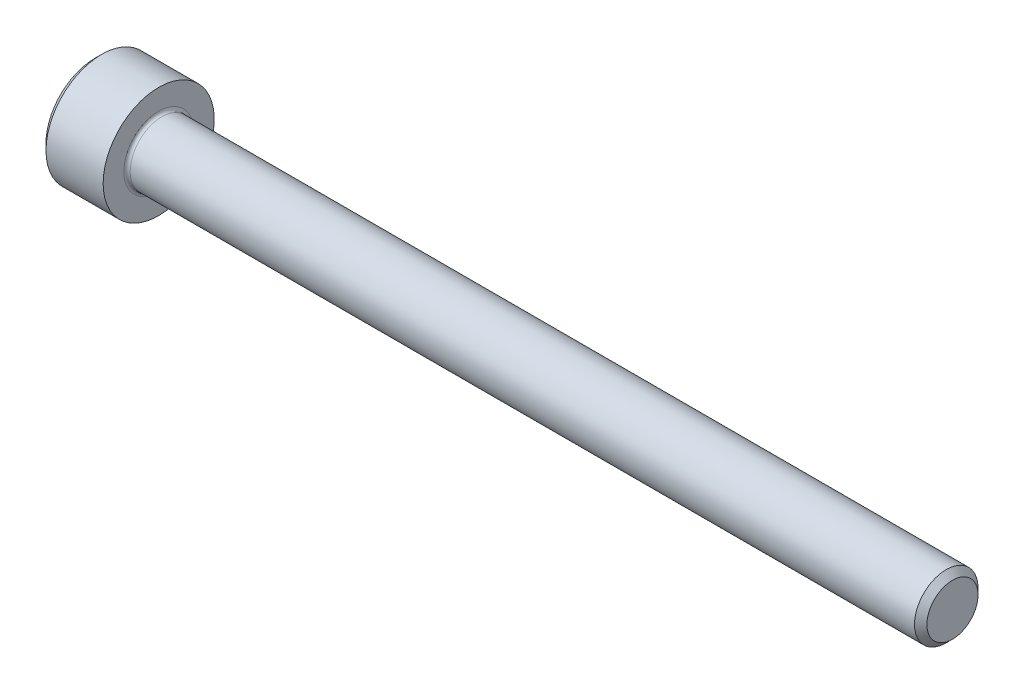
ISO-10303-21;
HEADER;
FILE_DESCRIPTION(('STEP AP214'),'2;1');
FILE_NAME('part.step','',(''),(''),'','','');
FILE_SCHEMA(('AUTOMOTIVE_DESIGN { 1 0 10303 214 1 1 1 1 }'));
ENDSEC;
DATA;
#1=APPLICATION_CONTEXT('core data for automotive mechanical design processes');
#2=APPLICATION_PROTOCOL_DEFINITION('international standard','automotive_design',2000,#1);
#3=PRODUCT_CONTEXT('',#1,'mechanical');
#4=PRODUCT('Part','Part','',(#3));
#5=PRODUCT_RELATED_PRODUCT_CATEGORY('part','',(#4));
#6=PRODUCT_DEFINITION_FORMATION('','',#4);
#7=PRODUCT_DEFINITION_CONTEXT('part definition',#1,'design');
#8=PRODUCT_DEFINITION('design','',#6,#7);
#9=PRODUCT_DEFINITION_SHAPE('','',#8);
#10=(LENGTH_UNIT() NAMED_UNIT(*) SI_UNIT(.MILLI.,.METRE.));
#11=(NAMED_UNIT(*) PLANE_ANGLE_UNIT() SI_UNIT($,.RADIAN.));
#12=(NAMED_UNIT(*) SI_UNIT($,.STERADIAN.) SOLID_ANGLE_UNIT());
#13=UNCERTAINTY_MEASURE_WITH_UNIT(LENGTH_MEASURE(1.E-05),#10,'distance_accuracy_value','');
#14=(GEOMETRIC_REPRESENTATION_CONTEXT(3) GLOBAL_UNCERTAINTY_ASSIGNED_CONTEXT((#13)) GLOBAL_UNIT_ASSIGNED_CONTEXT((#10,
#11,#12)) REPRESENTATION_CONTEXT('',''));
#15=CARTESIAN_POINT('',(0.,0.,0.));
#16=DIRECTION('',(0.,0.,1.));
#17=DIRECTION('',(1.,0.,0.));
#18=AXIS2_PLACEMENT_3D('',#15,#16,#17);
#19=CARTESIAN_POINT('',(2.00000000012324,0.,0.));
#20=DIRECTION('',(-1.,0.,0.));
#21=DIRECTION('',(0.,0.,1.));
#22=AXIS2_PLACEMENT_3D('',#19,#20,#21);
#23=CONICAL_SURFACE('',#22,1.53549999976121,1.04719755097356);
#24=CARTESIAN_POINT('',(2.88652133838241,0.,3.12638803734444E-10));
#25=VERTEX_POINT('',#24);
#26=VERTEX_LOOP('',#25);
#27=FACE_BOUND('',#26,.T.);
#28=CARTESIAN_POINT('',(1.99999999999196,0.,0.));
#29=DIRECTION('',(-1.,0.,0.));
#30=DIRECTION('',(0.,0.,1.));
#31=AXIS2_PLACEMENT_3D('',#28,#29,#30);
#32=CIRCLE('',#31,1.53549999998859);
#33=CARTESIAN_POINT('',(1.99999999999837,0.,1.53549999999715));
#34=VERTEX_POINT('',#33);
#35=CARTESIAN_POINT('',(1.99999999999598,-1.32978200750606,0.767749999997149));
#36=VERTEX_POINT('',#35);
#37=EDGE_CURVE('E95',#34,#36,#32,.F.);
#38=ORIENTED_EDGE('',*,*,#37,.F.);
#39=CARTESIAN_POINT('',(1.99999999999196,0.,0.));
#40=DIRECTION('',(-1.,0.,0.));
#41=DIRECTION('',(0.,0.,1.));
#42=AXIS2_PLACEMENT_3D('',#39,#40,#41);
#43=CIRCLE('',#42,1.53549999998859);
#44=CARTESIAN_POINT('',(1.99999999999598,1.32978200750606,0.767749999997146));
#45=VERTEX_POINT('',#44);
#46=EDGE_CURVE('E98',#34,#45,#43,.T.);
#47=ORIENTED_EDGE('',*,*,#46,.T.);
#48=CARTESIAN_POINT('',(1.99999999999196,0.,0.));
#49=DIRECTION('',(-1.,0.,0.));
#50=DIRECTION('',(0.,0.,1.));
#51=AXIS2_PLACEMENT_3D('',#48,#49,#50);
#52=CIRCLE('',#51,1.53549999998859);
#53=CARTESIAN_POINT('',(1.99999999999598,1.32978200750606,-0.767749999997149));
#54=VERTEX_POINT('',#53);
#55=EDGE_CURVE('E120',#45,#54,#52,.T.);
#56=ORIENTED_EDGE('',*,*,#55,.T.);
#57=CARTESIAN_POINT('',(1.99999999999196,0.,0.));
#58=DIRECTION('',(-1.,0.,0.));
#59=DIRECTION('',(0.,0.,1.));
#60=AXIS2_PLACEMENT_3D('',#57,#58,#59);
#61=CIRCLE('',#60,1.53549999998859);
#62=CARTESIAN_POINT('',(1.99999999999837,0.,-1.53549999999715));
#63=VERTEX_POINT('',#62);
#64=EDGE_CURVE('E147',#54,#63,#61,.T.);
#65=ORIENTED_EDGE('',*,*,#64,.T.);
#66=CARTESIAN_POINT('',(1.99999999999196,0.,0.));
#67=DIRECTION('',(-1.,0.,0.));
#68=DIRECTION('',(0.,0.,1.));
#69=AXIS2_PLACEMENT_3D('',#66,#67,#68);
#70=CIRCLE('',#69,1.53549999998859);
#71=CARTESIAN_POINT('',(1.99999999999598,-1.32978200750607,-0.767749999997148));
#72=VERTEX_POINT('',#71);
#73=EDGE_CURVE('E121',#72,#63,#70,.F.);
#74=ORIENTED_EDGE('',*,*,#73,.F.);
#75=CARTESIAN_POINT('',(1.99999999999196,0.,0.));
#76=DIRECTION('',(-1.,0.,0.));
#77=DIRECTION('',(0.,0.,1.));
#78=AXIS2_PLACEMENT_3D('',#75,#76,#77);
#79=CIRCLE('',#78,1.53549999998859);
#80=EDGE_CURVE('E101',#36,#72,#79,.F.);
#81=ORIENTED_EDGE('',*,*,#80,.F.);
#82=EDGE_LOOP('',(#38,#47,#56,#65,#74,#81));
#83=FACE_BOUND('',#82,.T.);
#84=ADVANCED_FACE('F16',(#27,#83),#23,.F.);
#85=CARTESIAN_POINT('',(2.,1.77304267668134,0.));
#86=DIRECTION('',(1.,0.,0.));
#87=DIRECTION('',(0.,0.,-1.));
#88=AXIS2_PLACEMENT_3D('',#85,#86,#87);
#89=PLANE('',#88);
#90=DIRECTION('',(0.,0.5,-0.866025403784439));
#91=VECTOR('',#90,1.);
#92=CARTESIAN_POINT('',(2.,1.77304267668134,0.));
#93=LINE('',#92,#91);
#94=CARTESIAN_POINT('',(2.,0.886521338340668,1.5355));
#95=VERTEX_POINT('',#94);
#96=EDGE_CURVE('E113',#45,#95,#93,.F.);
#97=ORIENTED_EDGE('',*,*,#96,.F.);
#98=ORIENTED_EDGE('',*,*,#46,.F.);
#99=DIRECTION('',(0.,-1.,0.));
#100=VECTOR('',#99,1.);
#101=CARTESIAN_POINT('',(2.,-0.886521338340673,1.5355));
#102=LINE('',#101,#100);
#103=EDGE_CURVE('E112',#34,#95,#102,.F.);
#104=ORIENTED_EDGE('',*,*,#103,.T.);
#105=EDGE_LOOP('',(#97,#98,#104));
#106=FACE_BOUND('',#105,.T.);
#107=ADVANCED_FACE('F117',(#106),#89,.F.);
#108=CARTESIAN_POINT('',(2.,1.77304267668134,0.));
#109=DIRECTION('',(1.,0.,0.));
#110=DIRECTION('',(0.,0.,-1.));
#111=AXIS2_PLACEMENT_3D('',#108,#109,#110);
#112=PLANE('',#111);
#113=DIRECTION('',(0.,-1.,0.));
#114=VECTOR('',#113,1.);
#115=CARTESIAN_POINT('',(2.,-0.886521338340673,1.5355));
#116=LINE('',#115,#114);
#117=CARTESIAN_POINT('',(2.,-0.886521338340673,1.5355));
#118=VERTEX_POINT('',#117);
#119=EDGE_CURVE('E106',#118,#34,#116,.F.);
#120=ORIENTED_EDGE('',*,*,#119,.T.);
#121=ORIENTED_EDGE('',*,*,#37,.T.);
#122=DIRECTION('',(0.,0.500000000000001,0.866025403784438));
#123=VECTOR('',#122,1.);
#124=CARTESIAN_POINT('',(2.,-0.886521338340673,1.5355));
#125=LINE('',#124,#123);
#126=EDGE_CURVE('E108',#118,#36,#125,.F.);
#127=ORIENTED_EDGE('',*,*,#126,.F.);
#128=EDGE_LOOP('',(#120,#121,#127));
#129=FACE_BOUND('',#128,.T.);
#130=ADVANCED_FACE('F107',(#129),#112,.F.);
#131=CARTESIAN_POINT('',(2.,1.77304267668134,0.));
#132=DIRECTION('',(1.,0.,0.));
#133=DIRECTION('',(0.,0.,-1.));
#134=AXIS2_PLACEMENT_3D('',#131,#132,#133);
#135=PLANE('',#134);
#136=DIRECTION('',(0.,0.500000000000001,0.866025403784438));
#137=VECTOR('',#136,1.);
#138=CARTESIAN_POINT('',(2.,-0.886521338340673,1.5355));
#139=LINE('',#138,#137);
#140=CARTESIAN_POINT('',(2.,-1.77304267668135,0.));
#141=VERTEX_POINT('',#140);
#142=EDGE_CURVE('E437',#36,#141,#139,.F.);
#143=ORIENTED_EDGE('',*,*,#142,.F.);
#144=ORIENTED_EDGE('',*,*,#80,.T.);
#145=DIRECTION('',(0.,-0.5,0.866025403784439));
#146=VECTOR('',#145,1.);
#147=CARTESIAN_POINT('',(2.,-1.77304267668135,0.));
#148=LINE('',#147,#146);
#149=EDGE_CURVE('E439',#141,#72,#148,.F.);
#150=ORIENTED_EDGE('',*,*,#149,.F.);
#151=EDGE_LOOP('',(#143,#144,#150));
#152=FACE_BOUND('',#151,.T.);
#153=ADVANCED_FACE('F268',(#152),#135,.F.);
#154=CARTESIAN_POINT('',(2.,1.77304267668134,0.));
#155=DIRECTION('',(1.,0.,0.));
#156=DIRECTION('',(0.,0.,-1.));
#157=AXIS2_PLACEMENT_3D('',#154,#155,#156);
#158=PLANE('',#157);
#159=DIRECTION('',(0.,-0.5,0.866025403784439));
#160=VECTOR('',#159,1.);
#161=CARTESIAN_POINT('',(2.,-1.77304267668135,0.));
#162=LINE('',#161,#160);
#163=CARTESIAN_POINT('',(2.,-0.886521338340675,-1.5355));
#164=VERTEX_POINT('',#163);
#165=EDGE_CURVE('E476',#72,#164,#162,.F.);
#166=ORIENTED_EDGE('',*,*,#165,.F.);
#167=ORIENTED_EDGE('',*,*,#73,.T.);
#168=DIRECTION('',(0.,1.,0.));
#169=VECTOR('',#168,1.);
#170=CARTESIAN_POINT('',(2.,0.886521338340666,-1.5355));
#171=LINE('',#170,#169);
#172=EDGE_CURVE('E472',#63,#164,#171,.F.);
#173=ORIENTED_EDGE('',*,*,#172,.T.);
#174=EDGE_LOOP('',(#166,#167,#173));
#175=FACE_BOUND('',#174,.T.);
#176=ADVANCED_FACE('F264',(#175),#158,.F.);
#177=CARTESIAN_POINT('',(2.,1.77304267668134,0.));
#178=DIRECTION('',(1.,0.,0.));
#179=DIRECTION('',(0.,0.,-1.));
#180=AXIS2_PLACEMENT_3D('',#177,#178,#179);
#181=PLANE('',#180);
#182=DIRECTION('',(0.,0.500000000000001,0.866025403784438));
#183=VECTOR('',#182,1.);
#184=CARTESIAN_POINT('',(2.,1.77304267668134,0.));
#185=LINE('',#184,#183);
#186=CARTESIAN_POINT('',(2.,1.77304267668134,0.));
#187=VERTEX_POINT('',#186);
#188=EDGE_CURVE('E493',#187,#54,#185,.F.);
#189=ORIENTED_EDGE('',*,*,#188,.T.);
#190=ORIENTED_EDGE('',*,*,#55,.F.);
#191=DIRECTION('',(0.,0.5,-0.866025403784439));
#192=VECTOR('',#191,1.);
#193=CARTESIAN_POINT('',(2.,1.77304267668134,0.));
#194=LINE('',#193,#192);
#195=EDGE_CURVE('E133',#187,#45,#194,.F.);
#196=ORIENTED_EDGE('',*,*,#195,.F.);
#197=EDGE_LOOP('',(#189,#190,#196));
#198=FACE_BOUND('',#197,.T.);
#199=ADVANCED_FACE('F260',(#198),#181,.F.);
#200=CARTESIAN_POINT('',(2.,1.77304267668134,0.));
#201=DIRECTION('',(1.,0.,0.));
#202=DIRECTION('',(0.,0.,-1.));
#203=AXIS2_PLACEMENT_3D('',#200,#201,#202);
#204=PLANE('',#203);
#205=DIRECTION('',(0.,1.,0.));
#206=VECTOR('',#205,1.);
#207=CARTESIAN_POINT('',(2.,0.886521338340666,-1.5355));
#208=LINE('',#207,#206);
#209=CARTESIAN_POINT('',(2.,0.886521338340666,-1.5355));
#210=VERTEX_POINT('',#209);
#211=EDGE_CURVE('E475',#210,#63,#208,.F.);
#212=ORIENTED_EDGE('',*,*,#211,.T.);
#213=ORIENTED_EDGE('',*,*,#64,.F.);
#214=DIRECTION('',(0.,0.500000000000001,0.866025403784438));
#215=VECTOR('',#214,1.);
#216=CARTESIAN_POINT('',(2.,1.77304267668134,0.));
#217=LINE('',#216,#215);
#218=EDGE_CURVE('E466',#54,#210,#217,.F.);
#219=ORIENTED_EDGE('',*,*,#218,.T.);
#220=EDGE_LOOP('',(#212,#213,#219));
#221=FACE_BOUND('',#220,.T.);
#222=ADVANCED_FACE('F256',(#221),#204,.F.);
#223=CARTESIAN_POINT('',(2.,1.77304267668134,0.));
#224=DIRECTION('',(0.,-0.866025403784439,-0.5));
#225=DIRECTION('',(0.,0.5,-0.866025403784439));
#226=AXIS2_PLACEMENT_3D('',#223,#224,#225);
#227=PLANE('',#226);
#228=ORIENTED_EDGE('',*,*,#96,.T.);
#229=DIRECTION('',(1.,0.,0.));
#230=VECTOR('',#229,1.);
#231=CARTESIAN_POINT('',(2.,0.886521338340669,1.5355));
#232=LINE('',#231,#230);
#233=CARTESIAN_POINT('',(0.,0.886521338340668,1.5355));
#234=VERTEX_POINT('',#233);
#235=EDGE_CURVE('E126',#95,#234,#232,.F.);
#236=ORIENTED_EDGE('',*,*,#235,.T.);
#237=DIRECTION('',(0.,-0.5,0.866025403784438));
#238=VECTOR('',#237,1.);
#239=CARTESIAN_POINT('',(0.,1.77304267668134,0.));
#240=LINE('',#239,#238);
#241=CARTESIAN_POINT('',(0.,1.77304267668134,0.));
#242=VERTEX_POINT('',#241);
#243=EDGE_CURVE('E458',#242,#234,#240,.T.);
#244=ORIENTED_EDGE('',*,*,#243,.F.);
#245=DIRECTION('',(1.,0.,0.));
#246=VECTOR('',#245,1.);
#247=CARTESIAN_POINT('',(2.,1.77304267668134,0.));
#248=LINE('',#247,#246);
#249=EDGE_CURVE('E479',#242,#187,#248,.T.);
#250=ORIENTED_EDGE('',*,*,#249,.T.);
#251=ORIENTED_EDGE('',*,*,#195,.T.);
#252=EDGE_LOOP('',(#228,#236,#244,#250,#251));
#253=FACE_BOUND('',#252,.T.);
#254=ADVANCED_FACE('F253',(#253),#227,.T.);
#255=CARTESIAN_POINT('',(2.,-0.886521338340673,1.5355));
#256=DIRECTION('',(0.,0.,1.));
#257=DIRECTION('',(0.,-1.,0.));
#258=AXIS2_PLACEMENT_3D('',#255,#256,#257);
#259=PLANE('',#258);
#260=ORIENTED_EDGE('',*,*,#235,.F.);
#261=ORIENTED_EDGE('',*,*,#103,.F.);
#262=ORIENTED_EDGE('',*,*,#119,.F.);
#263=DIRECTION('',(1.,0.,0.));
#264=VECTOR('',#263,1.);
#265=CARTESIAN_POINT('',(2.,-0.886521338340673,1.5355));
#266=LINE('',#265,#264);
#267=CARTESIAN_POINT('',(0.,-0.886521338340673,1.5355));
#268=VERTEX_POINT('',#267);
#269=EDGE_CURVE('E128',#268,#118,#266,.T.);
#270=ORIENTED_EDGE('',*,*,#269,.F.);
#271=DIRECTION('',(0.,1.,0.));
#272=VECTOR('',#271,1.);
#273=CARTESIAN_POINT('',(0.,0.,1.5355));
#274=LINE('',#273,#272);
#275=EDGE_CURVE('E132',#234,#268,#274,.F.);
#276=ORIENTED_EDGE('',*,*,#275,.F.);
#277=EDGE_LOOP('',(#260,#261,#262,#270,#276));
#278=FACE_BOUND('',#277,.T.);
#279=ADVANCED_FACE('F124',(#278),#259,.F.);
#280=CARTESIAN_POINT('',(2.,-0.886521338340673,1.5355));
#281=DIRECTION('',(0.,0.866025403784438,-0.500000000000001));
#282=DIRECTION('',(0.,0.500000000000001,0.866025403784438));
#283=AXIS2_PLACEMENT_3D('',#280,#281,#282);
#284=PLANE('',#283);
#285=ORIENTED_EDGE('',*,*,#142,.T.);
#286=DIRECTION('',(1.,0.,0.));
#287=VECTOR('',#286,1.);
#288=CARTESIAN_POINT('',(2.,-1.77304267668135,0.));
#289=LINE('',#288,#287);
#290=CARTESIAN_POINT('',(0.,-1.77304267668135,0.));
#291=VERTEX_POINT('',#290);
#292=EDGE_CURVE('E441',#291,#141,#289,.T.);
#293=ORIENTED_EDGE('',*,*,#292,.F.);
#294=DIRECTION('',(0.,-0.500000000000001,-0.866025403784438));
#295=VECTOR('',#294,1.);
#296=CARTESIAN_POINT('',(0.,-0.886521338340673,1.5355));
#297=LINE('',#296,#295);
#298=EDGE_CURVE('E451',#268,#291,#297,.T.);
#299=ORIENTED_EDGE('',*,*,#298,.F.);
#300=ORIENTED_EDGE('',*,*,#269,.T.);
#301=ORIENTED_EDGE('',*,*,#126,.T.);
#302=EDGE_LOOP('',(#285,#293,#299,#300,#301));
#303=FACE_BOUND('',#302,.T.);
#304=ADVANCED_FACE('F246',(#303),#284,.T.);
#305=CARTESIAN_POINT('',(2.,-1.77304267668135,0.));
#306=DIRECTION('',(0.,0.866025403784439,0.5));
#307=DIRECTION('',(0.,-0.5,0.866025403784439));
#308=AXIS2_PLACEMENT_3D('',#305,#306,#307);
#309=PLANE('',#308);
#310=ORIENTED_EDGE('',*,*,#165,.T.);
#311=DIRECTION('',(1.,0.,0.));
#312=VECTOR('',#311,1.);
#313=CARTESIAN_POINT('',(2.,-0.886521338340675,-1.5355));
#314=LINE('',#313,#312);
#315=CARTESIAN_POINT('',(0.,-0.886521338340675,-1.5355));
#316=VERTEX_POINT('',#315);
#317=EDGE_CURVE('E474',#164,#316,#314,.F.);
#318=ORIENTED_EDGE('',*,*,#317,.T.);
#319=DIRECTION('',(0.,0.5,-0.866025403784439));
#320=VECTOR('',#319,1.);
#321=CARTESIAN_POINT('',(0.,-1.77304267668135,0.));
#322=LINE('',#321,#320);
#323=EDGE_CURVE('E447',#291,#316,#322,.T.);
#324=ORIENTED_EDGE('',*,*,#323,.F.);
#325=ORIENTED_EDGE('',*,*,#292,.T.);
#326=ORIENTED_EDGE('',*,*,#149,.T.);
#327=EDGE_LOOP('',(#310,#318,#324,#325,#326));
#328=FACE_BOUND('',#327,.T.);
#329=ADVANCED_FACE('F242',(#328),#309,.T.);
#330=CARTESIAN_POINT('',(2.,0.886521338340666,-1.5355));
#331=DIRECTION('',(0.,0.,-1.));
#332=DIRECTION('',(0.,1.,0.));
#333=AXIS2_PLACEMENT_3D('',#330,#331,#332);
#334=PLANE('',#333);
#335=ORIENTED_EDGE('',*,*,#317,.F.);
#336=ORIENTED_EDGE('',*,*,#172,.F.);
#337=ORIENTED_EDGE('',*,*,#211,.F.);
#338=DIRECTION('',(1.,0.,0.));
#339=VECTOR('',#338,1.);
#340=CARTESIAN_POINT('',(2.,0.886521338340666,-1.5355));
#341=LINE('',#340,#339);
#342=CARTESIAN_POINT('',(0.,0.886521338340667,-1.5355));
#343=VERTEX_POINT('',#342);
#344=EDGE_CURVE('E464',#210,#343,#341,.F.);
#345=ORIENTED_EDGE('',*,*,#344,.T.);
#346=DIRECTION('',(0.,1.,0.));
#347=VECTOR('',#346,1.);
#348=CARTESIAN_POINT('',(0.,0.,-1.5355));
#349=LINE('',#348,#347);
#350=EDGE_CURVE('E450',#316,#343,#349,.T.);
#351=ORIENTED_EDGE('',*,*,#350,.F.);
#352=EDGE_LOOP('',(#335,#336,#337,#345,#351));
#353=FACE_BOUND('',#352,.T.);
#354=ADVANCED_FACE('F238',(#353),#334,.F.);
#355=CARTESIAN_POINT('',(2.,1.77304267668134,0.));
#356=DIRECTION('',(0.,0.866025403784438,-0.500000000000001));
#357=DIRECTION('',(0.,0.500000000000001,0.866025403784438));
#358=AXIS2_PLACEMENT_3D('',#355,#356,#357);
#359=PLANE('',#358);
#360=ORIENTED_EDGE('',*,*,#344,.F.);
#361=ORIENTED_EDGE('',*,*,#218,.F.);
#362=ORIENTED_EDGE('',*,*,#188,.F.);
#363=ORIENTED_EDGE('',*,*,#249,.F.);
#364=DIRECTION('',(0.,0.500000000000001,0.866025403784438));
#365=VECTOR('',#364,1.);
#366=CARTESIAN_POINT('',(0.,0.886521338340666,-1.5355));
#367=LINE('',#366,#365);
#368=EDGE_CURVE('E146',#343,#242,#367,.T.);
#369=ORIENTED_EDGE('',*,*,#368,.F.);
#370=EDGE_LOOP('',(#360,#361,#362,#363,#369));
#371=FACE_BOUND('',#370,.T.);
#372=ADVANCED_FACE('F234',(#371),#359,.F.);
#373=CARTESIAN_POINT('',(0.,0.,0.));
#374=DIRECTION('',(-1.,0.,0.));
#375=DIRECTION('',(0.,0.,1.));
#376=AXIS2_PLACEMENT_3D('',#373,#374,#375);
#377=PLANE('',#376);
#378=CARTESIAN_POINT('',(0.,0.,0.));
#379=DIRECTION('',(1.,0.,0.));
#380=DIRECTION('',(0.,1.,0.));
#381=AXIS2_PLACEMENT_3D('',#378,#379,#380);
#382=CIRCLE('',#381,3.0999999999608);
#383=CARTESIAN_POINT('',(0.,3.0999999999608,0.));
#384=VERTEX_POINT('',#383);
#385=EDGE_CURVE('E143',#384,#384,#382,.T.);
#386=ORIENTED_EDGE('',*,*,#385,.F.);
#387=EDGE_LOOP('',(#386));
#388=FACE_BOUND('',#387,.T.);
#389=ORIENTED_EDGE('',*,*,#350,.T.);
#390=ORIENTED_EDGE('',*,*,#368,.T.);
#391=ORIENTED_EDGE('',*,*,#243,.T.);
#392=ORIENTED_EDGE('',*,*,#275,.T.);
#393=ORIENTED_EDGE('',*,*,#298,.T.);
#394=ORIENTED_EDGE('',*,*,#323,.T.);
#395=EDGE_LOOP('',(#389,#390,#391,#392,#393,#394));
#396=FACE_BOUND('',#395,.T.);
#397=ADVANCED_FACE('F226',(#388,#396),#377,.T.);
#398=CARTESIAN_POINT('',(0.399999999899592,0.,0.));
#399=DIRECTION('',(1.,0.,0.));
#400=DIRECTION('',(0.,1.,0.));
#401=AXIS2_PLACEMENT_3D('',#398,#399,#400);
#402=CONICAL_SURFACE('',#401,3.49999999986039,0.785398163397448);
#403=ORIENTED_EDGE('',*,*,#385,.T.);
#404=EDGE_LOOP('',(#403));
#405=FACE_BOUND('',#404,.T.);
#406=CARTESIAN_POINT('',(0.399999999999998,0.,0.));
#407=DIRECTION('',(-1.,0.,0.));
#408=DIRECTION('',(0.,0.,1.));
#409=AXIS2_PLACEMENT_3D('',#406,#407,#408);
#410=CIRCLE('',#409,3.5);
#411=CARTESIAN_POINT('',(0.399999999999998,0.,3.5));
#412=VERTEX_POINT('',#411);
#413=EDGE_CURVE('E142',#412,#412,#410,.F.);
#414=ORIENTED_EDGE('',*,*,#413,.F.);
#415=EDGE_LOOP('',(#414));
#416=FACE_BOUND('',#415,.T.);
#417=ADVANCED_FACE('F221',(#405,#416),#402,.T.);
#418=CARTESIAN_POINT('',(-31.75,0.,0.));
#419=DIRECTION('',(-1.,0.,0.));
#420=DIRECTION('',(0.,0.,1.));
#421=AXIS2_PLACEMENT_3D('',#418,#419,#420);
#422=CYLINDRICAL_SURFACE('',#421,3.5);
#423=CARTESIAN_POINT('',(4.,0.,0.));
#424=DIRECTION('',(-1.,0.,0.));
#425=DIRECTION('',(0.,0.,1.));
#426=AXIS2_PLACEMENT_3D('',#423,#424,#425);
#427=CIRCLE('',#426,3.5);
#428=CARTESIAN_POINT('',(4.,0.,3.5));
#429=VERTEX_POINT('',#428);
#430=EDGE_CURVE('E139',#429,#429,#427,.F.);
#431=ORIENTED_EDGE('',*,*,#430,.F.);
#432=EDGE_LOOP('',(#431));
#433=FACE_BOUND('',#432,.T.);
#434=ORIENTED_EDGE('',*,*,#413,.T.);
#435=EDGE_LOOP('',(#434));
#436=FACE_BOUND('',#435,.T.);
#437=ADVANCED_FACE('F217',(#433,#436),#422,.T.);
#438=CARTESIAN_POINT('',(54.,1.61,0.));
#439=DIRECTION('',(1.,0.,0.));
#440=DIRECTION('',(0.,0.,-1.));
#441=AXIS2_PLACEMENT_3D('',#438,#439,#440);
#442=PLANE('',#441);
#443=CARTESIAN_POINT('',(54.0000000000305,0.,0.));
#444=DIRECTION('',(-1.,0.,0.));
#445=DIRECTION('',(0.,0.,1.));
#446=AXIS2_PLACEMENT_3D('',#443,#444,#445);
#447=CIRCLE('',#446,1.60999999991418);
#448=CARTESIAN_POINT('',(54.0000000000305,0.,1.60999999991418));
#449=VERTEX_POINT('',#448);
#450=EDGE_CURVE('E135',#449,#449,#447,.T.);
#451=ORIENTED_EDGE('',*,*,#450,.F.);
#452=EDGE_LOOP('',(#451));
#453=FACE_BOUND('',#452,.T.);
#454=ADVANCED_FACE('F175',(#453),#442,.T.);
#455=CARTESIAN_POINT('',(4.,3.5,0.));
#456=DIRECTION('',(1.,0.,0.));
#457=DIRECTION('',(0.,0.,-1.));
#458=AXIS2_PLACEMENT_3D('',#455,#456,#457);
#459=PLANE('',#458);
#460=ORIENTED_EDGE('',*,*,#430,.T.);
#461=EDGE_LOOP('',(#460));
#462=FACE_BOUND('',#461,.T.);
#463=CARTESIAN_POINT('',(4.,0.,0.));
#464=DIRECTION('',(1.,0.,0.));
#465=DIRECTION('',(0.,0.,1.));
#466=AXIS2_PLACEMENT_3D('',#463,#464,#465);
#467=CIRCLE('',#466,2.19999999999999);
#468=CARTESIAN_POINT('',(4.,0.,-2.19999999999999));
#469=VERTEX_POINT('',#468);
#470=CARTESIAN_POINT('',(4.,0.,2.19999999999999));
#471=VERTEX_POINT('',#470);
#472=EDGE_CURVE('E138',#469,#471,#467,.F.);
#473=ORIENTED_EDGE('',*,*,#472,.T.);
#474=CARTESIAN_POINT('',(4.,0.,0.));
#475=DIRECTION('',(1.,0.,0.));
#476=DIRECTION('',(0.,0.,-1.));
#477=AXIS2_PLACEMENT_3D('',#474,#475,#476);
#478=CIRCLE('',#477,2.19999999999999);
#479=EDGE_CURVE('E35',#471,#469,#478,.F.);
#480=ORIENTED_EDGE('',*,*,#479,.T.);
#481=EDGE_LOOP('',(#473,#480));
#482=FACE_BOUND('',#481,.T.);
#483=ADVANCED_FACE('F156',(#462,#482),#459,.T.);
#484=CARTESIAN_POINT('',(53.6100000000488,0.,0.));
#485=DIRECTION('',(-1.,0.,0.));
#486=DIRECTION('',(0.,0.,1.));
#487=AXIS2_PLACEMENT_3D('',#484,#485,#486);
#488=CONICAL_SURFACE('',#487,1.99999999989586,0.785398163397448);
#489=CARTESIAN_POINT('',(53.61,0.,0.));
#490=DIRECTION('',(-1.,0.,0.));
#491=DIRECTION('',(0.,0.,1.));
#492=AXIS2_PLACEMENT_3D('',#489,#490,#491);
#493=CIRCLE('',#492,1.99999999999999);
#494=CARTESIAN_POINT('',(53.61,0.,1.99999999999999));
#495=VERTEX_POINT('',#494);
#496=EDGE_CURVE('E27',#495,#495,#493,.T.);
#497=ORIENTED_EDGE('',*,*,#496,.F.);
#498=EDGE_LOOP('',(#497));
#499=FACE_BOUND('',#498,.T.);
#500=ORIENTED_EDGE('',*,*,#450,.T.);
#501=EDGE_LOOP('',(#500));
#502=FACE_BOUND('',#501,.T.);
#503=ADVANCED_FACE('F174',(#499,#502),#488,.T.);
#504=CARTESIAN_POINT('',(4.2,0.,0.));
#505=DIRECTION('',(1.,0.,0.));
#506=DIRECTION('',(0.,0.,-1.));
#507=AXIS2_PLACEMENT_3D('',#504,#505,#506);
#508=TOROIDAL_SURFACE('',#507,2.19999999999999,0.2);
#509=CARTESIAN_POINT('',(4.2,0.,0.));
#510=DIRECTION('',(-1.,0.,0.));
#511=DIRECTION('',(0.,0.,1.));
#512=AXIS2_PLACEMENT_3D('',#509,#510,#511);
#513=CIRCLE('',#512,1.99999999999999);
#514=CARTESIAN_POINT('',(4.2,0.,1.99999999999999));
#515=VERTEX_POINT('',#514);
#516=EDGE_CURVE('E11',#515,#515,#513,.F.);
#517=ORIENTED_EDGE('',*,*,#516,.F.);
#518=EDGE_LOOP('',(#517));
#519=FACE_BOUND('',#518,.T.);
#520=ORIENTED_EDGE('',*,*,#472,.F.);
#521=ORIENTED_EDGE('',*,*,#479,.F.);
#522=EDGE_LOOP('',(#520,#521));
#523=FACE_BOUND('',#522,.T.);
#524=ADVANCED_FACE('F153',(#519,#523),#508,.F.);
#525=CARTESIAN_POINT('',(-31.75,0.,0.));
#526=DIRECTION('',(-1.,0.,0.));
#527=DIRECTION('',(0.,0.,1.));
#528=AXIS2_PLACEMENT_3D('',#525,#526,#527);
#529=CYLINDRICAL_SURFACE('',#528,1.99999999999999);
#530=ORIENTED_EDGE('',*,*,#516,.T.);
#531=EDGE_LOOP('',(#530));
#532=FACE_BOUND('',#531,.T.);
#533=ORIENTED_EDGE('',*,*,#496,.T.);
#534=EDGE_LOOP('',(#533));
#535=FACE_BOUND('',#534,.T.);
#536=ADVANCED_FACE('F199',(#532,#535),#529,.T.);
#537=CLOSED_SHELL('',(#84,#107,#130,#153,#176,#199,#222,#254,#279,#304,#329,#354,#372,#397,#417,
#437,#454,#483,#503,#524,#536));
#538=MANIFOLD_SOLID_BREP('B1',#537);
#539=ADVANCED_BREP_SHAPE_REPRESENTATION('',(#18,#538),#14);
#540=SHAPE_DEFINITION_REPRESENTATION(#9,#539);
ENDSEC;
END-ISO-10303-21;
